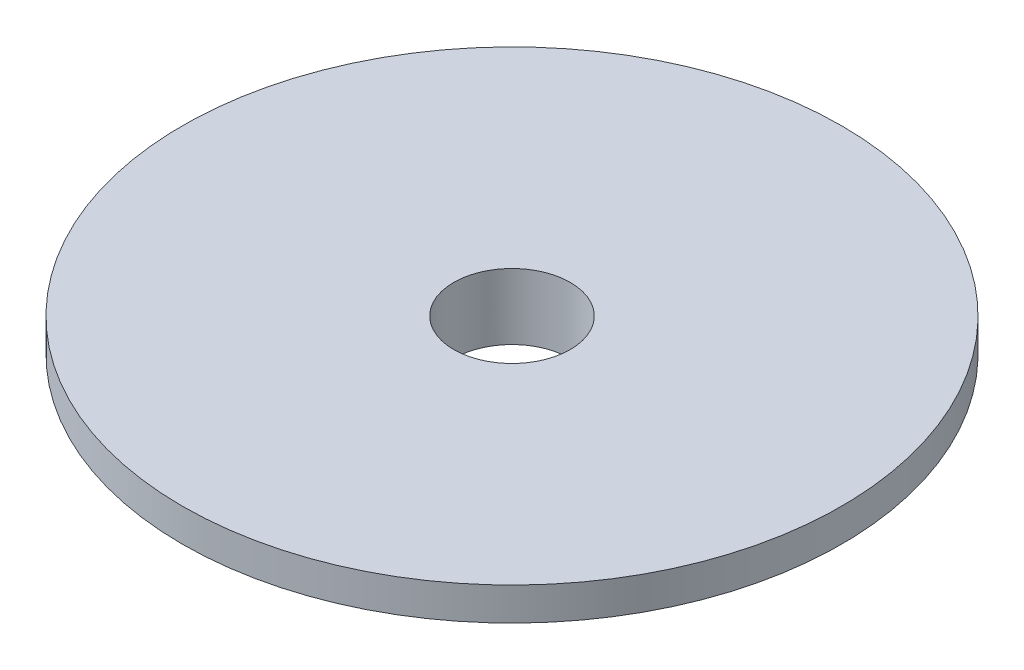
ISO-10303-21;
HEADER;
FILE_DESCRIPTION(('STEP AP214'),'2;1');
FILE_NAME('part.step','',(''),(''),'','','');
FILE_SCHEMA(('AUTOMOTIVE_DESIGN { 1 0 10303 214 1 1 1 1 }'));
ENDSEC;
DATA;
#1=APPLICATION_CONTEXT('core data for automotive mechanical design processes');
#2=APPLICATION_PROTOCOL_DEFINITION('international standard','automotive_design',2000,#1);
#3=PRODUCT_CONTEXT('',#1,'mechanical');
#4=PRODUCT('Part','Part','',(#3));
#5=PRODUCT_RELATED_PRODUCT_CATEGORY('part','',(#4));
#6=PRODUCT_DEFINITION_FORMATION('','',#4);
#7=PRODUCT_DEFINITION_CONTEXT('part definition',#1,'design');
#8=PRODUCT_DEFINITION('design','',#6,#7);
#9=PRODUCT_DEFINITION_SHAPE('','',#8);
#10=(LENGTH_UNIT() NAMED_UNIT(*) SI_UNIT(.MILLI.,.METRE.));
#11=(NAMED_UNIT(*) PLANE_ANGLE_UNIT() SI_UNIT($,.RADIAN.));
#12=(NAMED_UNIT(*) SI_UNIT($,.STERADIAN.) SOLID_ANGLE_UNIT());
#13=UNCERTAINTY_MEASURE_WITH_UNIT(LENGTH_MEASURE(1.E-05),#10,'distance_accuracy_value','');
#14=(GEOMETRIC_REPRESENTATION_CONTEXT(3) GLOBAL_UNCERTAINTY_ASSIGNED_CONTEXT((#13)) GLOBAL_UNIT_ASSIGNED_CONTEXT((#10,
#11,#12)) REPRESENTATION_CONTEXT('',''));
#15=CARTESIAN_POINT('',(0.,0.,0.));
#16=DIRECTION('',(0.,0.,1.));
#17=DIRECTION('',(1.,0.,0.));
#18=AXIS2_PLACEMENT_3D('',#15,#16,#17);
#19=CARTESIAN_POINT('',(0.,0.,0.));
#20=DIRECTION('',(0.,1.,0.));
#21=DIRECTION('',(0.,0.,1.));
#22=AXIS2_PLACEMENT_3D('',#19,#20,#21);
#23=PLANE('',#22);
#24=CARTESIAN_POINT('',(0.,0.,0.));
#25=DIRECTION('',(0.,1.,0.));
#26=DIRECTION('',(0.,0.,1.));
#27=AXIS2_PLACEMENT_3D('',#24,#25,#26);
#28=CIRCLE('',#27,15.);
#29=CARTESIAN_POINT('',(0.,0.,15.));
#30=VERTEX_POINT('',#29);
#31=EDGE_CURVE('E50',#30,#30,#28,.T.);
#32=ORIENTED_EDGE('',*,*,#31,.F.);
#33=EDGE_LOOP('',(#32));
#34=FACE_BOUND('',#33,.T.);
#35=CARTESIAN_POINT('',(0.,0.,0.));
#36=DIRECTION('',(0.,1.,0.));
#37=DIRECTION('',(0.,0.,1.));
#38=AXIS2_PLACEMENT_3D('',#35,#36,#37);
#39=CIRCLE('',#38,6.);
#40=CARTESIAN_POINT('',(0.,0.,6.));
#41=VERTEX_POINT('',#40);
#42=EDGE_CURVE('E10',#41,#41,#39,.F.);
#43=ORIENTED_EDGE('',*,*,#42,.F.);
#44=EDGE_LOOP('',(#43));
#45=FACE_BOUND('',#44,.T.);
#46=ADVANCED_FACE('F37',(#34,#45),#23,.F.);
#47=CARTESIAN_POINT('',(0.,1.5,0.));
#48=DIRECTION('',(0.,1.,0.));
#49=DIRECTION('',(0.,0.,1.));
#50=AXIS2_PLACEMENT_3D('',#47,#48,#49);
#51=PLANE('',#50);
#52=CARTESIAN_POINT('',(0.,1.5,0.));
#53=DIRECTION('',(0.,1.,0.));
#54=DIRECTION('',(0.,0.,1.));
#55=AXIS2_PLACEMENT_3D('',#52,#53,#54);
#56=CIRCLE('',#55,15.);
#57=CARTESIAN_POINT('',(0.,1.5,15.));
#58=VERTEX_POINT('',#57);
#59=EDGE_CURVE('E45',#58,#58,#56,.T.);
#60=ORIENTED_EDGE('',*,*,#59,.T.);
#61=EDGE_LOOP('',(#60));
#62=FACE_BOUND('',#61,.T.);
#63=CARTESIAN_POINT('',(0.,1.5,0.));
#64=DIRECTION('',(0.,1.,0.));
#65=DIRECTION('',(0.,0.,1.));
#66=AXIS2_PLACEMENT_3D('',#63,#64,#65);
#67=CIRCLE('',#66,2.65);
#68=CARTESIAN_POINT('',(0.,1.5,2.65));
#69=VERTEX_POINT('',#68);
#70=EDGE_CURVE('E56',#69,#69,#67,.T.);
#71=ORIENTED_EDGE('',*,*,#70,.F.);
#72=EDGE_LOOP('',(#71));
#73=FACE_BOUND('',#72,.T.);
#74=ADVANCED_FACE('F86',(#62,#73),#51,.T.);
#75=CARTESIAN_POINT('',(0.,1.5,0.));
#76=DIRECTION('',(0.,-1.,0.));
#77=DIRECTION('',(0.,0.,-1.));
#78=AXIS2_PLACEMENT_3D('',#75,#76,#77);
#79=CYLINDRICAL_SURFACE('',#78,15.);
#80=ORIENTED_EDGE('',*,*,#59,.F.);
#81=EDGE_LOOP('',(#80));
#82=FACE_BOUND('',#81,.T.);
#83=ORIENTED_EDGE('',*,*,#31,.T.);
#84=EDGE_LOOP('',(#83));
#85=FACE_BOUND('',#84,.T.);
#86=ADVANCED_FACE('F39',(#82,#85),#79,.T.);
#87=CARTESIAN_POINT('',(0.,1.5,0.));
#88=DIRECTION('',(0.,-1.,0.));
#89=DIRECTION('',(0.,0.,-1.));
#90=AXIS2_PLACEMENT_3D('',#87,#88,#89);
#91=CYLINDRICAL_SURFACE('',#90,2.65);
#92=ORIENTED_EDGE('',*,*,#70,.T.);
#93=EDGE_LOOP('',(#92));
#94=FACE_BOUND('',#93,.T.);
#95=CARTESIAN_POINT('',(0.,-1.5,0.));
#96=DIRECTION('',(0.,-1.,0.));
#97=DIRECTION('',(0.,0.,-1.));
#98=AXIS2_PLACEMENT_3D('',#95,#96,#97);
#99=CIRCLE('',#98,2.65);
#100=CARTESIAN_POINT('',(0.,-1.5,-2.65));
#101=VERTEX_POINT('',#100);
#102=EDGE_CURVE('E65',#101,#101,#99,.T.);
#103=ORIENTED_EDGE('',*,*,#102,.T.);
#104=EDGE_LOOP('',(#103));
#105=FACE_BOUND('',#104,.T.);
#106=ADVANCED_FACE('F70',(#94,#105),#91,.F.);
#107=CARTESIAN_POINT('',(0.,-1.5,0.));
#108=DIRECTION('',(0.,-1.,0.));
#109=DIRECTION('',(0.,0.,-1.));
#110=AXIS2_PLACEMENT_3D('',#107,#108,#109);
#111=PLANE('',#110);
#112=CARTESIAN_POINT('',(0.,-1.5,0.));
#113=DIRECTION('',(0.,-1.,0.));
#114=DIRECTION('',(0.,0.,-1.));
#115=AXIS2_PLACEMENT_3D('',#112,#113,#114);
#116=CIRCLE('',#115,6.);
#117=CARTESIAN_POINT('',(0.,-1.5,-6.));
#118=VERTEX_POINT('',#117);
#119=EDGE_CURVE('E61',#118,#118,#116,.T.);
#120=ORIENTED_EDGE('',*,*,#119,.T.);
#121=EDGE_LOOP('',(#120));
#122=FACE_BOUND('',#121,.T.);
#123=ORIENTED_EDGE('',*,*,#102,.F.);
#124=EDGE_LOOP('',(#123));
#125=FACE_BOUND('',#124,.T.);
#126=ADVANCED_FACE('F72',(#122,#125),#111,.T.);
#127=CARTESIAN_POINT('',(0.,-1.5,0.));
#128=DIRECTION('',(0.,1.,0.));
#129=DIRECTION('',(0.,0.,1.));
#130=AXIS2_PLACEMENT_3D('',#127,#128,#129);
#131=CYLINDRICAL_SURFACE('',#130,6.);
#132=ORIENTED_EDGE('',*,*,#119,.F.);
#133=EDGE_LOOP('',(#132));
#134=FACE_BOUND('',#133,.T.);
#135=ORIENTED_EDGE('',*,*,#42,.T.);
#136=EDGE_LOOP('',(#135));
#137=FACE_BOUND('',#136,.T.);
#138=ADVANCED_FACE('F74',(#134,#137),#131,.T.);
#139=CLOSED_SHELL('',(#46,#74,#86,#106,#126,#138));
#140=MANIFOLD_SOLID_BREP('B2',#139);
#141=ADVANCED_BREP_SHAPE_REPRESENTATION('',(#18,#140),#14);
#142=SHAPE_DEFINITION_REPRESENTATION(#9,#141);
ENDSEC;
END-ISO-10303-21;
